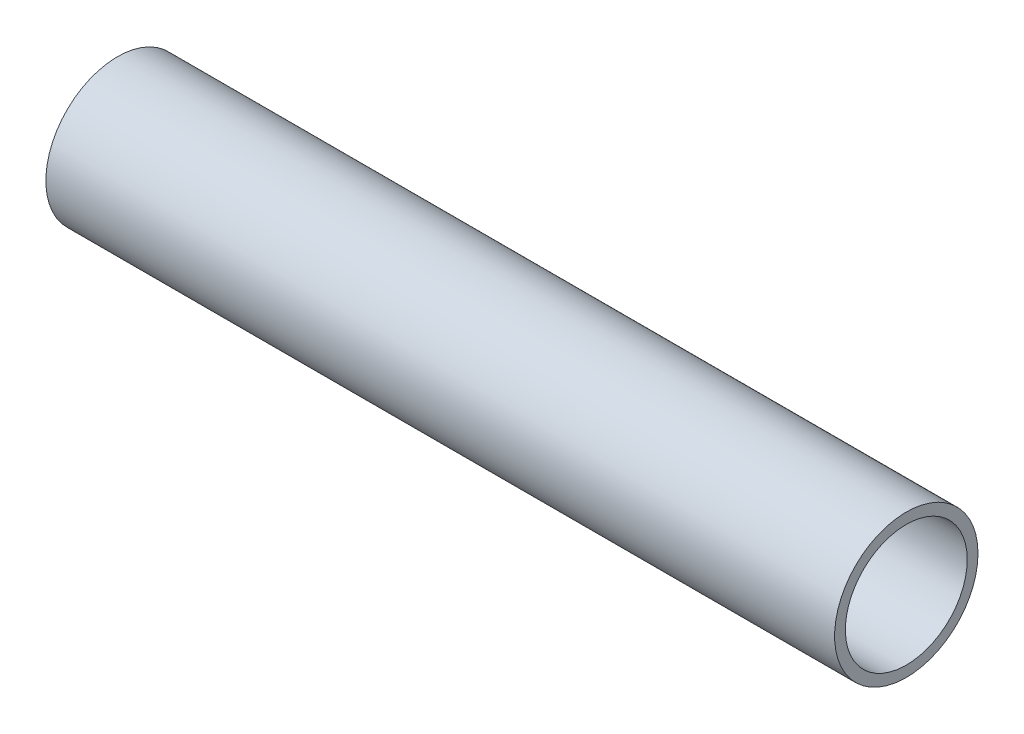
ISO-10303-21;
HEADER;
FILE_DESCRIPTION(('STEP AP214'),'2;1');
FILE_NAME('part.step','',(''),(''),'','','');
FILE_SCHEMA(('AUTOMOTIVE_DESIGN { 1 0 10303 214 1 1 1 1 }'));
ENDSEC;
DATA;
#1=APPLICATION_CONTEXT('core data for automotive mechanical design processes');
#2=APPLICATION_PROTOCOL_DEFINITION('international standard','automotive_design',2000,#1);
#3=PRODUCT_CONTEXT('',#1,'mechanical');
#4=PRODUCT('Part','Part','',(#3));
#5=PRODUCT_RELATED_PRODUCT_CATEGORY('part','',(#4));
#6=PRODUCT_DEFINITION_FORMATION('','',#4);
#7=PRODUCT_DEFINITION_CONTEXT('part definition',#1,'design');
#8=PRODUCT_DEFINITION('design','',#6,#7);
#9=PRODUCT_DEFINITION_SHAPE('','',#8);
#10=(LENGTH_UNIT() NAMED_UNIT(*) SI_UNIT(.MILLI.,.METRE.));
#11=(NAMED_UNIT(*) PLANE_ANGLE_UNIT() SI_UNIT($,.RADIAN.));
#12=(NAMED_UNIT(*) SI_UNIT($,.STERADIAN.) SOLID_ANGLE_UNIT());
#13=UNCERTAINTY_MEASURE_WITH_UNIT(LENGTH_MEASURE(1.E-05),#10,'distance_accuracy_value','');
#14=(GEOMETRIC_REPRESENTATION_CONTEXT(3) GLOBAL_UNCERTAINTY_ASSIGNED_CONTEXT((#13)) GLOBAL_UNIT_ASSIGNED_CONTEXT((#10,
#11,#12)) REPRESENTATION_CONTEXT('',''));
#15=CARTESIAN_POINT('',(0.,0.,0.));
#16=DIRECTION('',(0.,0.,1.));
#17=DIRECTION('',(1.,0.,0.));
#18=AXIS2_PLACEMENT_3D('',#15,#16,#17);
#19=CARTESIAN_POINT('',(110.,0.,0.));
#20=DIRECTION('',(1.,0.,0.));
#21=DIRECTION('',(0.,0.,-1.));
#22=AXIS2_PLACEMENT_3D('',#19,#20,#21);
#23=PLANE('',#22);
#24=CARTESIAN_POINT('',(110.,0.,0.));
#25=DIRECTION('',(1.,0.,0.));
#26=DIRECTION('',(0.,0.,-1.));
#27=AXIS2_PLACEMENT_3D('',#24,#25,#26);
#28=CIRCLE('',#27,10.);
#29=CARTESIAN_POINT('',(110.,0.,-10.));
#30=VERTEX_POINT('',#29);
#31=EDGE_CURVE('E10',#30,#30,#28,.T.);
#32=ORIENTED_EDGE('',*,*,#31,.T.);
#33=EDGE_LOOP('',(#32));
#34=FACE_BOUND('',#33,.T.);
#35=CARTESIAN_POINT('',(110.,0.,0.));
#36=DIRECTION('',(1.,0.,0.));
#37=DIRECTION('',(0.,0.,-1.));
#38=AXIS2_PLACEMENT_3D('',#35,#36,#37);
#39=CIRCLE('',#38,8.5);
#40=CARTESIAN_POINT('',(110.,0.,-8.5));
#41=VERTEX_POINT('',#40);
#42=EDGE_CURVE('E43',#41,#41,#39,.T.);
#43=ORIENTED_EDGE('',*,*,#42,.F.);
#44=EDGE_LOOP('',(#43));
#45=FACE_BOUND('',#44,.T.);
#46=ADVANCED_FACE('F32',(#34,#45),#23,.T.);
#47=CARTESIAN_POINT('',(0.,0.,0.));
#48=DIRECTION('',(1.,0.,0.));
#49=DIRECTION('',(0.,0.,-1.));
#50=AXIS2_PLACEMENT_3D('',#47,#48,#49);
#51=PLANE('',#50);
#52=CARTESIAN_POINT('',(0.,0.,0.));
#53=DIRECTION('',(1.,0.,0.));
#54=DIRECTION('',(0.,0.,-1.));
#55=AXIS2_PLACEMENT_3D('',#52,#53,#54);
#56=CIRCLE('',#55,10.);
#57=CARTESIAN_POINT('',(0.,0.,-10.));
#58=VERTEX_POINT('',#57);
#59=EDGE_CURVE('E36',#58,#58,#56,.T.);
#60=ORIENTED_EDGE('',*,*,#59,.F.);
#61=EDGE_LOOP('',(#60));
#62=FACE_BOUND('',#61,.T.);
#63=CARTESIAN_POINT('',(0.,0.,0.));
#64=DIRECTION('',(1.,0.,0.));
#65=DIRECTION('',(0.,0.,-1.));
#66=AXIS2_PLACEMENT_3D('',#63,#64,#65);
#67=CIRCLE('',#66,8.5);
#68=CARTESIAN_POINT('',(0.,0.,-8.5));
#69=VERTEX_POINT('',#68);
#70=EDGE_CURVE('E45',#69,#69,#67,.T.);
#71=ORIENTED_EDGE('',*,*,#70,.T.);
#72=EDGE_LOOP('',(#71));
#73=FACE_BOUND('',#72,.T.);
#74=ADVANCED_FACE('F55',(#62,#73),#51,.F.);
#75=CARTESIAN_POINT('',(110.,0.,0.));
#76=DIRECTION('',(-1.,0.,0.));
#77=DIRECTION('',(0.,0.,1.));
#78=AXIS2_PLACEMENT_3D('',#75,#76,#77);
#79=CYLINDRICAL_SURFACE('',#78,10.);
#80=ORIENTED_EDGE('',*,*,#31,.F.);
#81=EDGE_LOOP('',(#80));
#82=FACE_BOUND('',#81,.T.);
#83=ORIENTED_EDGE('',*,*,#59,.T.);
#84=EDGE_LOOP('',(#83));
#85=FACE_BOUND('',#84,.T.);
#86=ADVANCED_FACE('F34',(#82,#85),#79,.T.);
#87=CARTESIAN_POINT('',(110.,0.,0.));
#88=DIRECTION('',(-1.,0.,0.));
#89=DIRECTION('',(0.,0.,1.));
#90=AXIS2_PLACEMENT_3D('',#87,#88,#89);
#91=CYLINDRICAL_SURFACE('',#90,8.5);
#92=ORIENTED_EDGE('',*,*,#42,.T.);
#93=EDGE_LOOP('',(#92));
#94=FACE_BOUND('',#93,.T.);
#95=ORIENTED_EDGE('',*,*,#70,.F.);
#96=EDGE_LOOP('',(#95));
#97=FACE_BOUND('',#96,.T.);
#98=ADVANCED_FACE('F51',(#94,#97),#91,.F.);
#99=CLOSED_SHELL('',(#46,#74,#86,#98));
#100=MANIFOLD_SOLID_BREP('B2',#99);
#101=ADVANCED_BREP_SHAPE_REPRESENTATION('',(#18,#100),#14);
#102=SHAPE_DEFINITION_REPRESENTATION(#9,#101);
ENDSEC;
END-ISO-10303-21;
